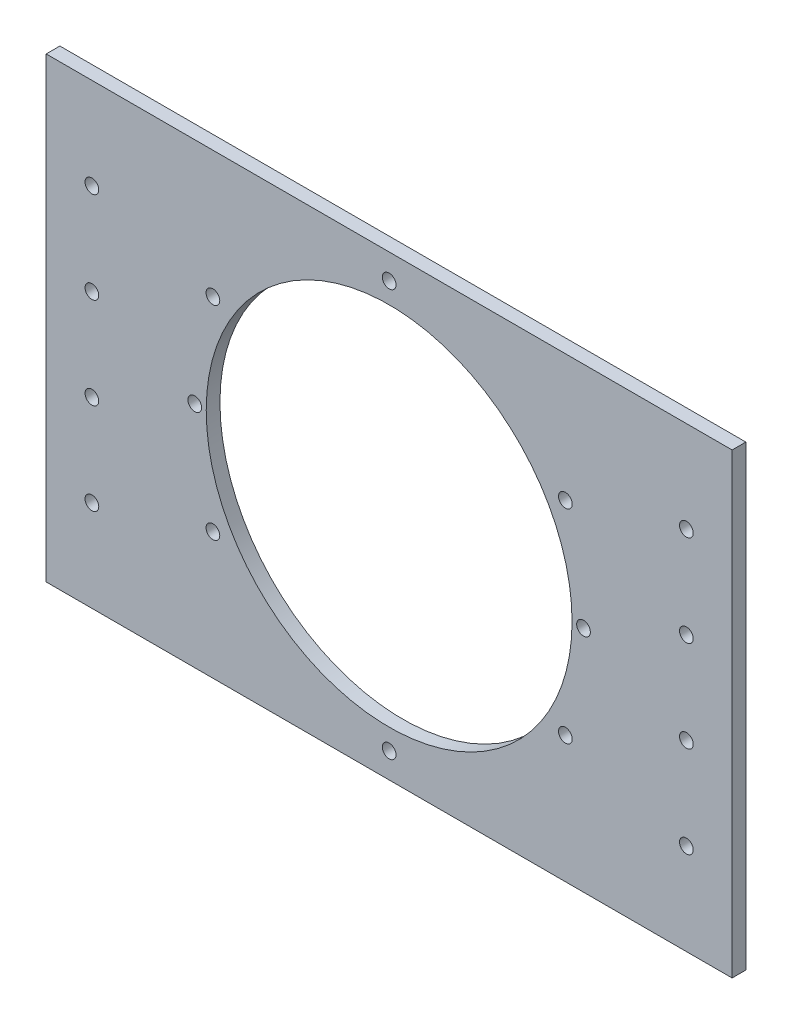
ISO-10303-21;
HEADER;
FILE_DESCRIPTION(('STEP AP214'),'2;1');
FILE_NAME('part.step','',(''),(''),'','','');
FILE_SCHEMA(('AUTOMOTIVE_DESIGN { 1 0 10303 214 1 1 1 1 }'));
ENDSEC;
DATA;
#1=APPLICATION_CONTEXT('core data for automotive mechanical design processes');
#2=APPLICATION_PROTOCOL_DEFINITION('international standard','automotive_design',2000,#1);
#3=PRODUCT_CONTEXT('',#1,'mechanical');
#4=PRODUCT('Part','Part','',(#3));
#5=PRODUCT_RELATED_PRODUCT_CATEGORY('part','',(#4));
#6=PRODUCT_DEFINITION_FORMATION('','',#4);
#7=PRODUCT_DEFINITION_CONTEXT('part definition',#1,'design');
#8=PRODUCT_DEFINITION('design','',#6,#7);
#9=PRODUCT_DEFINITION_SHAPE('','',#8);
#10=(LENGTH_UNIT() NAMED_UNIT(*) SI_UNIT(.MILLI.,.METRE.));
#11=(NAMED_UNIT(*) PLANE_ANGLE_UNIT() SI_UNIT($,.RADIAN.));
#12=(NAMED_UNIT(*) SI_UNIT($,.STERADIAN.) SOLID_ANGLE_UNIT());
#13=UNCERTAINTY_MEASURE_WITH_UNIT(LENGTH_MEASURE(1.E-05),#10,'distance_accuracy_value','');
#14=(GEOMETRIC_REPRESENTATION_CONTEXT(3) GLOBAL_UNCERTAINTY_ASSIGNED_CONTEXT((#13)) GLOBAL_UNIT_ASSIGNED_CONTEXT((#10,
#11,#12)) REPRESENTATION_CONTEXT('',''));
#15=CARTESIAN_POINT('',(0.,0.,0.));
#16=DIRECTION('',(0.,0.,1.));
#17=DIRECTION('',(1.,0.,0.));
#18=AXIS2_PLACEMENT_3D('',#15,#16,#17);
#19=CARTESIAN_POINT('',(75.,0.,3.));
#20=DIRECTION('',(1.,0.,0.));
#21=DIRECTION('',(0.,1.,0.));
#22=AXIS2_PLACEMENT_3D('',#19,#20,#21);
#23=PLANE('',#22);
#24=DIRECTION('',(0.,-1.,0.));
#25=VECTOR('',#24,1.);
#26=CARTESIAN_POINT('',(75.,0.,0.));
#27=LINE('',#26,#25);
#28=CARTESIAN_POINT('',(75.,50.,0.));
#29=VERTEX_POINT('',#28);
#30=CARTESIAN_POINT('',(75.,-50.,0.));
#31=VERTEX_POINT('',#30);
#32=EDGE_CURVE('E163',#29,#31,#27,.T.);
#33=ORIENTED_EDGE('',*,*,#32,.F.);
#34=DIRECTION('',(0.,0.,-1.));
#35=VECTOR('',#34,1.);
#36=CARTESIAN_POINT('',(75.,50.,3.));
#37=LINE('',#36,#35);
#38=CARTESIAN_POINT('',(75.,50.,3.));
#39=VERTEX_POINT('',#38);
#40=EDGE_CURVE('E11',#39,#29,#37,.T.);
#41=ORIENTED_EDGE('',*,*,#40,.F.);
#42=DIRECTION('',(0.,-1.,0.));
#43=VECTOR('',#42,1.);
#44=CARTESIAN_POINT('',(75.,0.,3.));
#45=LINE('',#44,#43);
#46=CARTESIAN_POINT('',(75.,-50.,3.));
#47=VERTEX_POINT('',#46);
#48=EDGE_CURVE('E105',#39,#47,#45,.T.);
#49=ORIENTED_EDGE('',*,*,#48,.T.);
#50=DIRECTION('',(0.,0.,-1.));
#51=VECTOR('',#50,1.);
#52=CARTESIAN_POINT('',(75.,-50.,3.));
#53=LINE('',#52,#51);
#54=EDGE_CURVE('E83',#47,#31,#53,.T.);
#55=ORIENTED_EDGE('',*,*,#54,.T.);
#56=EDGE_LOOP('',(#33,#41,#49,#55));
#57=FACE_BOUND('',#56,.T.);
#58=ADVANCED_FACE('F43',(#57),#23,.T.);
#59=CARTESIAN_POINT('',(0.,50.,3.));
#60=DIRECTION('',(0.,1.,0.));
#61=DIRECTION('',(0.,0.,1.));
#62=AXIS2_PLACEMENT_3D('',#59,#60,#61);
#63=PLANE('',#62);
#64=DIRECTION('',(1.,0.,0.));
#65=VECTOR('',#64,1.);
#66=CARTESIAN_POINT('',(0.,50.,0.));
#67=LINE('',#66,#65);
#68=CARTESIAN_POINT('',(-75.,50.,0.));
#69=VERTEX_POINT('',#68);
#70=EDGE_CURVE('E95',#69,#29,#67,.T.);
#71=ORIENTED_EDGE('',*,*,#70,.F.);
#72=DIRECTION('',(0.,0.,-1.));
#73=VECTOR('',#72,1.);
#74=CARTESIAN_POINT('',(-75.,50.,3.));
#75=LINE('',#74,#73);
#76=CARTESIAN_POINT('',(-75.,50.,3.));
#77=VERTEX_POINT('',#76);
#78=EDGE_CURVE('E52',#77,#69,#75,.T.);
#79=ORIENTED_EDGE('',*,*,#78,.F.);
#80=DIRECTION('',(1.,0.,0.));
#81=VECTOR('',#80,1.);
#82=CARTESIAN_POINT('',(0.,50.,3.));
#83=LINE('',#82,#81);
#84=EDGE_CURVE('E93',#77,#39,#83,.T.);
#85=ORIENTED_EDGE('',*,*,#84,.T.);
#86=ORIENTED_EDGE('',*,*,#40,.T.);
#87=EDGE_LOOP('',(#71,#79,#85,#86));
#88=FACE_BOUND('',#87,.T.);
#89=ADVANCED_FACE('F91',(#88),#63,.T.);
#90=CARTESIAN_POINT('',(-75.,0.,3.));
#91=DIRECTION('',(1.,0.,0.));
#92=DIRECTION('',(0.,1.,0.));
#93=AXIS2_PLACEMENT_3D('',#90,#91,#92);
#94=PLANE('',#93);
#95=DIRECTION('',(0.,-1.,0.));
#96=VECTOR('',#95,1.);
#97=CARTESIAN_POINT('',(-75.,0.,0.));
#98=LINE('',#97,#96);
#99=CARTESIAN_POINT('',(-75.,-50.,0.));
#100=VERTEX_POINT('',#99);
#101=EDGE_CURVE('E166',#69,#100,#98,.T.);
#102=ORIENTED_EDGE('',*,*,#101,.T.);
#103=DIRECTION('',(0.,0.,-1.));
#104=VECTOR('',#103,1.);
#105=CARTESIAN_POINT('',(-75.,-50.,3.));
#106=LINE('',#105,#104);
#107=CARTESIAN_POINT('',(-75.,-50.,3.));
#108=VERTEX_POINT('',#107);
#109=EDGE_CURVE('E98',#108,#100,#106,.T.);
#110=ORIENTED_EDGE('',*,*,#109,.F.);
#111=DIRECTION('',(0.,-1.,0.));
#112=VECTOR('',#111,1.);
#113=CARTESIAN_POINT('',(-75.,0.,3.));
#114=LINE('',#113,#112);
#115=EDGE_CURVE('E100',#77,#108,#114,.T.);
#116=ORIENTED_EDGE('',*,*,#115,.F.);
#117=ORIENTED_EDGE('',*,*,#78,.T.);
#118=EDGE_LOOP('',(#102,#110,#116,#117));
#119=FACE_BOUND('',#118,.T.);
#120=ADVANCED_FACE('F101',(#119),#94,.F.);
#121=CARTESIAN_POINT('',(65.,-9.99999999999998,3.));
#122=DIRECTION('',(0.,0.,-1.));
#123=DIRECTION('',(-1.,0.,0.));
#124=AXIS2_PLACEMENT_3D('',#121,#122,#123);
#125=CYLINDRICAL_SURFACE('',#124,1.5);
#126=CARTESIAN_POINT('',(65.,-9.99999999999998,3.));
#127=DIRECTION('',(0.,0.,1.));
#128=DIRECTION('',(1.,0.,0.));
#129=AXIS2_PLACEMENT_3D('',#126,#127,#128);
#130=CIRCLE('',#129,1.5);
#131=CARTESIAN_POINT('',(66.5,-9.99999999999998,3.));
#132=VERTEX_POINT('',#131);
#133=EDGE_CURVE('E112',#132,#132,#130,.F.);
#134=ORIENTED_EDGE('',*,*,#133,.F.);
#135=EDGE_LOOP('',(#134));
#136=FACE_BOUND('',#135,.T.);
#137=CARTESIAN_POINT('',(65.,-9.99999999999998,0.));
#138=DIRECTION('',(0.,0.,1.));
#139=DIRECTION('',(1.,0.,0.));
#140=AXIS2_PLACEMENT_3D('',#137,#138,#139);
#141=CIRCLE('',#140,1.5);
#142=CARTESIAN_POINT('',(66.5,-9.99999999999998,0.));
#143=VERTEX_POINT('',#142);
#144=EDGE_CURVE('E169',#143,#143,#141,.F.);
#145=ORIENTED_EDGE('',*,*,#144,.T.);
#146=EDGE_LOOP('',(#145));
#147=FACE_BOUND('',#146,.T.);
#148=ADVANCED_FACE('F305',(#136,#147),#125,.F.);
#149=CARTESIAN_POINT('',(0.,-50.,3.));
#150=DIRECTION('',(0.,1.,0.));
#151=DIRECTION('',(0.,0.,1.));
#152=AXIS2_PLACEMENT_3D('',#149,#150,#151);
#153=PLANE('',#152);
#154=DIRECTION('',(1.,0.,0.));
#155=VECTOR('',#154,1.);
#156=CARTESIAN_POINT('',(0.,-50.,0.));
#157=LINE('',#156,#155);
#158=EDGE_CURVE('E76',#100,#31,#157,.T.);
#159=ORIENTED_EDGE('',*,*,#158,.T.);
#160=ORIENTED_EDGE('',*,*,#54,.F.);
#161=DIRECTION('',(1.,0.,0.));
#162=VECTOR('',#161,1.);
#163=CARTESIAN_POINT('',(0.,-50.,3.));
#164=LINE('',#163,#162);
#165=EDGE_CURVE('E60',#108,#47,#164,.T.);
#166=ORIENTED_EDGE('',*,*,#165,.F.);
#167=ORIENTED_EDGE('',*,*,#109,.T.);
#168=EDGE_LOOP('',(#159,#160,#166,#167));
#169=FACE_BOUND('',#168,.T.);
#170=ADVANCED_FACE('F178',(#169),#153,.F.);
#171=CARTESIAN_POINT('',(-65.,30.,3.));
#172=DIRECTION('',(0.,0.,-1.));
#173=DIRECTION('',(-1.,0.,0.));
#174=AXIS2_PLACEMENT_3D('',#171,#172,#173);
#175=CYLINDRICAL_SURFACE('',#174,1.5);
#176=CARTESIAN_POINT('',(-65.,30.,3.));
#177=DIRECTION('',(0.,0.,1.));
#178=DIRECTION('',(1.,0.,0.));
#179=AXIS2_PLACEMENT_3D('',#176,#177,#178);
#180=CIRCLE('',#179,1.5);
#181=CARTESIAN_POINT('',(-63.5,30.,3.));
#182=VERTEX_POINT('',#181);
#183=EDGE_CURVE('E107',#182,#182,#180,.T.);
#184=ORIENTED_EDGE('',*,*,#183,.T.);
#185=EDGE_LOOP('',(#184));
#186=FACE_BOUND('',#185,.T.);
#187=CARTESIAN_POINT('',(-65.,30.,0.));
#188=DIRECTION('',(0.,0.,1.));
#189=DIRECTION('',(1.,0.,0.));
#190=AXIS2_PLACEMENT_3D('',#187,#188,#189);
#191=CIRCLE('',#190,1.5);
#192=CARTESIAN_POINT('',(-63.5,30.,0.));
#193=VERTEX_POINT('',#192);
#194=EDGE_CURVE('E160',#193,#193,#191,.T.);
#195=ORIENTED_EDGE('',*,*,#194,.F.);
#196=EDGE_LOOP('',(#195));
#197=FACE_BOUND('',#196,.T.);
#198=ADVANCED_FACE('F189',(#186,#197),#175,.F.);
#199=CARTESIAN_POINT('',(-65.,10.,3.));
#200=DIRECTION('',(0.,0.,-1.));
#201=DIRECTION('',(-1.,0.,0.));
#202=AXIS2_PLACEMENT_3D('',#199,#200,#201);
#203=CYLINDRICAL_SURFACE('',#202,1.5);
#204=CARTESIAN_POINT('',(-65.,10.,3.));
#205=DIRECTION('',(0.,0.,1.));
#206=DIRECTION('',(1.,0.,0.));
#207=AXIS2_PLACEMENT_3D('',#204,#205,#206);
#208=CIRCLE('',#207,1.5);
#209=CARTESIAN_POINT('',(-63.5,10.,3.));
#210=VERTEX_POINT('',#209);
#211=EDGE_CURVE('E513',#210,#210,#208,.T.);
#212=ORIENTED_EDGE('',*,*,#211,.T.);
#213=EDGE_LOOP('',(#212));
#214=FACE_BOUND('',#213,.T.);
#215=CARTESIAN_POINT('',(-65.,10.,0.));
#216=DIRECTION('',(0.,0.,1.));
#217=DIRECTION('',(1.,0.,0.));
#218=AXIS2_PLACEMENT_3D('',#215,#216,#217);
#219=CIRCLE('',#218,1.5);
#220=CARTESIAN_POINT('',(-63.5,10.,0.));
#221=VERTEX_POINT('',#220);
#222=EDGE_CURVE('E157',#221,#221,#219,.T.);
#223=ORIENTED_EDGE('',*,*,#222,.F.);
#224=EDGE_LOOP('',(#223));
#225=FACE_BOUND('',#224,.T.);
#226=ADVANCED_FACE('F192',(#214,#225),#203,.F.);
#227=CARTESIAN_POINT('',(-65.,-9.99999999999998,3.));
#228=DIRECTION('',(0.,0.,-1.));
#229=DIRECTION('',(-1.,0.,0.));
#230=AXIS2_PLACEMENT_3D('',#227,#228,#229);
#231=CYLINDRICAL_SURFACE('',#230,1.5);
#232=CARTESIAN_POINT('',(-65.,-9.99999999999998,3.));
#233=DIRECTION('',(0.,0.,1.));
#234=DIRECTION('',(1.,0.,0.));
#235=AXIS2_PLACEMENT_3D('',#232,#233,#234);
#236=CIRCLE('',#235,1.5);
#237=CARTESIAN_POINT('',(-63.5,-9.99999999999998,3.));
#238=VERTEX_POINT('',#237);
#239=EDGE_CURVE('E509',#238,#238,#236,.T.);
#240=ORIENTED_EDGE('',*,*,#239,.T.);
#241=EDGE_LOOP('',(#240));
#242=FACE_BOUND('',#241,.T.);
#243=CARTESIAN_POINT('',(-65.,-9.99999999999998,0.));
#244=DIRECTION('',(0.,0.,1.));
#245=DIRECTION('',(1.,0.,0.));
#246=AXIS2_PLACEMENT_3D('',#243,#244,#245);
#247=CIRCLE('',#246,1.5);
#248=CARTESIAN_POINT('',(-63.5,-9.99999999999998,0.));
#249=VERTEX_POINT('',#248);
#250=EDGE_CURVE('E154',#249,#249,#247,.T.);
#251=ORIENTED_EDGE('',*,*,#250,.F.);
#252=EDGE_LOOP('',(#251));
#253=FACE_BOUND('',#252,.T.);
#254=ADVANCED_FACE('F196',(#242,#253),#231,.F.);
#255=CARTESIAN_POINT('',(-65.,-30.,3.));
#256=DIRECTION('',(0.,0.,-1.));
#257=DIRECTION('',(-1.,0.,0.));
#258=AXIS2_PLACEMENT_3D('',#255,#256,#257);
#259=CYLINDRICAL_SURFACE('',#258,1.5);
#260=CARTESIAN_POINT('',(-65.,-30.,3.));
#261=DIRECTION('',(0.,0.,1.));
#262=DIRECTION('',(1.,0.,0.));
#263=AXIS2_PLACEMENT_3D('',#260,#261,#262);
#264=CIRCLE('',#263,1.5);
#265=CARTESIAN_POINT('',(-63.5,-30.,3.));
#266=VERTEX_POINT('',#265);
#267=EDGE_CURVE('E505',#266,#266,#264,.T.);
#268=ORIENTED_EDGE('',*,*,#267,.T.);
#269=EDGE_LOOP('',(#268));
#270=FACE_BOUND('',#269,.T.);
#271=CARTESIAN_POINT('',(-65.,-30.,0.));
#272=DIRECTION('',(0.,0.,1.));
#273=DIRECTION('',(1.,0.,0.));
#274=AXIS2_PLACEMENT_3D('',#271,#272,#273);
#275=CIRCLE('',#274,1.5);
#276=CARTESIAN_POINT('',(-63.5,-30.,0.));
#277=VERTEX_POINT('',#276);
#278=EDGE_CURVE('E151',#277,#277,#275,.T.);
#279=ORIENTED_EDGE('',*,*,#278,.F.);
#280=EDGE_LOOP('',(#279));
#281=FACE_BOUND('',#280,.T.);
#282=ADVANCED_FACE('F200',(#270,#281),#259,.F.);
#283=CARTESIAN_POINT('',(65.,-30.,3.));
#284=DIRECTION('',(0.,0.,-1.));
#285=DIRECTION('',(-1.,0.,0.));
#286=AXIS2_PLACEMENT_3D('',#283,#284,#285);
#287=CYLINDRICAL_SURFACE('',#286,1.5);
#288=CARTESIAN_POINT('',(65.,-30.,3.));
#289=DIRECTION('',(0.,0.,1.));
#290=DIRECTION('',(1.,0.,0.));
#291=AXIS2_PLACEMENT_3D('',#288,#289,#290);
#292=CIRCLE('',#291,1.5);
#293=CARTESIAN_POINT('',(66.5,-30.,3.));
#294=VERTEX_POINT('',#293);
#295=EDGE_CURVE('E501',#294,#294,#292,.F.);
#296=ORIENTED_EDGE('',*,*,#295,.F.);
#297=EDGE_LOOP('',(#296));
#298=FACE_BOUND('',#297,.T.);
#299=CARTESIAN_POINT('',(65.,-30.,0.));
#300=DIRECTION('',(0.,0.,1.));
#301=DIRECTION('',(1.,0.,0.));
#302=AXIS2_PLACEMENT_3D('',#299,#300,#301);
#303=CIRCLE('',#302,1.5);
#304=CARTESIAN_POINT('',(66.5,-30.,0.));
#305=VERTEX_POINT('',#304);
#306=EDGE_CURVE('E148',#305,#305,#303,.F.);
#307=ORIENTED_EDGE('',*,*,#306,.T.);
#308=EDGE_LOOP('',(#307));
#309=FACE_BOUND('',#308,.T.);
#310=ADVANCED_FACE('F204',(#298,#309),#287,.F.);
#311=CARTESIAN_POINT('',(65.,10.,3.));
#312=DIRECTION('',(0.,0.,-1.));
#313=DIRECTION('',(-1.,0.,0.));
#314=AXIS2_PLACEMENT_3D('',#311,#312,#313);
#315=CYLINDRICAL_SURFACE('',#314,1.5);
#316=CARTESIAN_POINT('',(65.,10.,3.));
#317=DIRECTION('',(0.,0.,1.));
#318=DIRECTION('',(1.,0.,0.));
#319=AXIS2_PLACEMENT_3D('',#316,#317,#318);
#320=CIRCLE('',#319,1.5);
#321=CARTESIAN_POINT('',(66.5,10.,3.));
#322=VERTEX_POINT('',#321);
#323=EDGE_CURVE('E497',#322,#322,#320,.F.);
#324=ORIENTED_EDGE('',*,*,#323,.F.);
#325=EDGE_LOOP('',(#324));
#326=FACE_BOUND('',#325,.T.);
#327=CARTESIAN_POINT('',(65.,10.,0.));
#328=DIRECTION('',(0.,0.,1.));
#329=DIRECTION('',(1.,0.,0.));
#330=AXIS2_PLACEMENT_3D('',#327,#328,#329);
#331=CIRCLE('',#330,1.5);
#332=CARTESIAN_POINT('',(66.5,10.,0.));
#333=VERTEX_POINT('',#332);
#334=EDGE_CURVE('E145',#333,#333,#331,.F.);
#335=ORIENTED_EDGE('',*,*,#334,.T.);
#336=EDGE_LOOP('',(#335));
#337=FACE_BOUND('',#336,.T.);
#338=ADVANCED_FACE('F208',(#326,#337),#315,.F.);
#339=CARTESIAN_POINT('',(0.,0.,3.));
#340=DIRECTION('',(0.,0.,-1.));
#341=DIRECTION('',(-1.,0.,0.));
#342=AXIS2_PLACEMENT_3D('',#339,#340,#341);
#343=CYLINDRICAL_SURFACE('',#342,40.);
#344=CARTESIAN_POINT('',(0.,0.,3.));
#345=DIRECTION('',(0.,0.,1.));
#346=DIRECTION('',(1.,0.,0.));
#347=AXIS2_PLACEMENT_3D('',#344,#345,#346);
#348=CIRCLE('',#347,40.);
#349=CARTESIAN_POINT('',(40.,0.,3.));
#350=VERTEX_POINT('',#349);
#351=EDGE_CURVE('E493',#350,#350,#348,.T.);
#352=ORIENTED_EDGE('',*,*,#351,.T.);
#353=EDGE_LOOP('',(#352));
#354=FACE_BOUND('',#353,.T.);
#355=CARTESIAN_POINT('',(0.,0.,0.));
#356=DIRECTION('',(0.,0.,1.));
#357=DIRECTION('',(1.,0.,0.));
#358=AXIS2_PLACEMENT_3D('',#355,#356,#357);
#359=CIRCLE('',#358,40.);
#360=CARTESIAN_POINT('',(40.,0.,0.));
#361=VERTEX_POINT('',#360);
#362=EDGE_CURVE('E142',#361,#361,#359,.T.);
#363=ORIENTED_EDGE('',*,*,#362,.F.);
#364=EDGE_LOOP('',(#363));
#365=FACE_BOUND('',#364,.T.);
#366=ADVANCED_FACE('F212',(#354,#365),#343,.F.);
#367=CARTESIAN_POINT('',(42.5,0.,3.));
#368=DIRECTION('',(0.,0.,-1.));
#369=DIRECTION('',(-1.,0.,0.));
#370=AXIS2_PLACEMENT_3D('',#367,#368,#369);
#371=CYLINDRICAL_SURFACE('',#370,1.5);
#372=CARTESIAN_POINT('',(42.5,0.,3.));
#373=DIRECTION('',(0.,0.,1.));
#374=DIRECTION('',(1.,0.,0.));
#375=AXIS2_PLACEMENT_3D('',#372,#373,#374);
#376=CIRCLE('',#375,1.5);
#377=CARTESIAN_POINT('',(44.,0.,3.));
#378=VERTEX_POINT('',#377);
#379=EDGE_CURVE('E489',#378,#378,#376,.T.);
#380=ORIENTED_EDGE('',*,*,#379,.T.);
#381=EDGE_LOOP('',(#380));
#382=FACE_BOUND('',#381,.T.);
#383=CARTESIAN_POINT('',(42.5,0.,0.));
#384=DIRECTION('',(0.,0.,1.));
#385=DIRECTION('',(1.,0.,0.));
#386=AXIS2_PLACEMENT_3D('',#383,#384,#385);
#387=CIRCLE('',#386,1.5);
#388=CARTESIAN_POINT('',(44.,0.,0.));
#389=VERTEX_POINT('',#388);
#390=EDGE_CURVE('E139',#389,#389,#387,.T.);
#391=ORIENTED_EDGE('',*,*,#390,.F.);
#392=EDGE_LOOP('',(#391));
#393=FACE_BOUND('',#392,.T.);
#394=ADVANCED_FACE('F216',(#382,#393),#371,.F.);
#395=CARTESIAN_POINT('',(-42.5,0.,3.));
#396=DIRECTION('',(0.,0.,-1.));
#397=DIRECTION('',(-1.,0.,0.));
#398=AXIS2_PLACEMENT_3D('',#395,#396,#397);
#399=CYLINDRICAL_SURFACE('',#398,1.5);
#400=CARTESIAN_POINT('',(-42.5,0.,3.));
#401=DIRECTION('',(0.,0.,1.));
#402=DIRECTION('',(1.,0.,0.));
#403=AXIS2_PLACEMENT_3D('',#400,#401,#402);
#404=CIRCLE('',#403,1.5);
#405=CARTESIAN_POINT('',(-41.,0.,3.));
#406=VERTEX_POINT('',#405);
#407=EDGE_CURVE('E485',#406,#406,#404,.T.);
#408=ORIENTED_EDGE('',*,*,#407,.T.);
#409=EDGE_LOOP('',(#408));
#410=FACE_BOUND('',#409,.T.);
#411=CARTESIAN_POINT('',(-42.5,0.,0.));
#412=DIRECTION('',(0.,0.,1.));
#413=DIRECTION('',(1.,0.,0.));
#414=AXIS2_PLACEMENT_3D('',#411,#412,#413);
#415=CIRCLE('',#414,1.5);
#416=CARTESIAN_POINT('',(-41.,0.,0.));
#417=VERTEX_POINT('',#416);
#418=EDGE_CURVE('E136',#417,#417,#415,.T.);
#419=ORIENTED_EDGE('',*,*,#418,.F.);
#420=EDGE_LOOP('',(#419));
#421=FACE_BOUND('',#420,.T.);
#422=ADVANCED_FACE('F220',(#410,#421),#399,.F.);
#423=CARTESIAN_POINT('',(0.,44.5,3.));
#424=DIRECTION('',(0.,0.,-1.));
#425=DIRECTION('',(-1.,0.,0.));
#426=AXIS2_PLACEMENT_3D('',#423,#424,#425);
#427=CYLINDRICAL_SURFACE('',#426,1.5);
#428=CARTESIAN_POINT('',(0.,44.5,3.));
#429=DIRECTION('',(0.,0.,1.));
#430=DIRECTION('',(1.,0.,0.));
#431=AXIS2_PLACEMENT_3D('',#428,#429,#430);
#432=CIRCLE('',#431,1.5);
#433=CARTESIAN_POINT('',(1.5,44.5,3.));
#434=VERTEX_POINT('',#433);
#435=EDGE_CURVE('E481',#434,#434,#432,.T.);
#436=ORIENTED_EDGE('',*,*,#435,.T.);
#437=EDGE_LOOP('',(#436));
#438=FACE_BOUND('',#437,.T.);
#439=CARTESIAN_POINT('',(0.,44.5,0.));
#440=DIRECTION('',(0.,0.,1.));
#441=DIRECTION('',(1.,0.,0.));
#442=AXIS2_PLACEMENT_3D('',#439,#440,#441);
#443=CIRCLE('',#442,1.5);
#444=CARTESIAN_POINT('',(1.5,44.5,0.));
#445=VERTEX_POINT('',#444);
#446=EDGE_CURVE('E133',#445,#445,#443,.T.);
#447=ORIENTED_EDGE('',*,*,#446,.F.);
#448=EDGE_LOOP('',(#447));
#449=FACE_BOUND('',#448,.T.);
#450=ADVANCED_FACE('F224',(#438,#449),#427,.F.);
#451=CARTESIAN_POINT('',(38.5381304684076,22.2499999999999,3.));
#452=DIRECTION('',(0.,0.,-1.));
#453=DIRECTION('',(-1.,0.,0.));
#454=AXIS2_PLACEMENT_3D('',#451,#452,#453);
#455=CYLINDRICAL_SURFACE('',#454,1.50000000000001);
#456=CARTESIAN_POINT('',(38.5381304684076,22.2499999999999,3.));
#457=DIRECTION('',(0.,0.,1.));
#458=DIRECTION('',(1.,0.,0.));
#459=AXIS2_PLACEMENT_3D('',#456,#457,#458);
#460=CIRCLE('',#459,1.50000000000001);
#461=CARTESIAN_POINT('',(40.0381304684076,22.2499999999999,3.));
#462=VERTEX_POINT('',#461);
#463=EDGE_CURVE('E477',#462,#462,#460,.T.);
#464=ORIENTED_EDGE('',*,*,#463,.T.);
#465=EDGE_LOOP('',(#464));
#466=FACE_BOUND('',#465,.T.);
#467=CARTESIAN_POINT('',(38.5381304684076,22.2499999999999,0.));
#468=DIRECTION('',(0.,0.,1.));
#469=DIRECTION('',(1.,0.,0.));
#470=AXIS2_PLACEMENT_3D('',#467,#468,#469);
#471=CIRCLE('',#470,1.50000000000001);
#472=CARTESIAN_POINT('',(40.0381304684076,22.2499999999999,0.));
#473=VERTEX_POINT('',#472);
#474=EDGE_CURVE('E130',#473,#473,#471,.T.);
#475=ORIENTED_EDGE('',*,*,#474,.F.);
#476=EDGE_LOOP('',(#475));
#477=FACE_BOUND('',#476,.T.);
#478=ADVANCED_FACE('F228',(#466,#477),#455,.F.);
#479=CARTESIAN_POINT('',(38.5381304684074,-22.2500000000002,3.));
#480=DIRECTION('',(0.,0.,-1.));
#481=DIRECTION('',(-1.,0.,0.));
#482=AXIS2_PLACEMENT_3D('',#479,#480,#481);
#483=CYLINDRICAL_SURFACE('',#482,1.5);
#484=CARTESIAN_POINT('',(38.5381304684074,-22.2500000000002,3.));
#485=DIRECTION('',(0.,0.,1.));
#486=DIRECTION('',(1.,0.,0.));
#487=AXIS2_PLACEMENT_3D('',#484,#485,#486);
#488=CIRCLE('',#487,1.5);
#489=CARTESIAN_POINT('',(40.0381304684074,-22.2500000000002,3.));
#490=VERTEX_POINT('',#489);
#491=EDGE_CURVE('E473',#490,#490,#488,.T.);
#492=ORIENTED_EDGE('',*,*,#491,.T.);
#493=EDGE_LOOP('',(#492));
#494=FACE_BOUND('',#493,.T.);
#495=CARTESIAN_POINT('',(38.5381304684074,-22.2500000000002,0.));
#496=DIRECTION('',(0.,0.,1.));
#497=DIRECTION('',(1.,0.,0.));
#498=AXIS2_PLACEMENT_3D('',#495,#496,#497);
#499=CIRCLE('',#498,1.5);
#500=CARTESIAN_POINT('',(40.0381304684074,-22.2500000000002,0.));
#501=VERTEX_POINT('',#500);
#502=EDGE_CURVE('E127',#501,#501,#499,.T.);
#503=ORIENTED_EDGE('',*,*,#502,.F.);
#504=EDGE_LOOP('',(#503));
#505=FACE_BOUND('',#504,.T.);
#506=ADVANCED_FACE('F232',(#494,#505),#483,.F.);
#507=CARTESIAN_POINT('',(-3.10741839157039E-13,-44.5,3.));
#508=DIRECTION('',(0.,0.,-1.));
#509=DIRECTION('',(-1.,0.,0.));
#510=AXIS2_PLACEMENT_3D('',#507,#508,#509);
#511=CYLINDRICAL_SURFACE('',#510,1.5);
#512=CARTESIAN_POINT('',(-3.10741839157039E-13,-44.5,3.));
#513=DIRECTION('',(0.,0.,1.));
#514=DIRECTION('',(1.,0.,0.));
#515=AXIS2_PLACEMENT_3D('',#512,#513,#514);
#516=CIRCLE('',#515,1.5);
#517=CARTESIAN_POINT('',(1.49999999999969,-44.5,3.));
#518=VERTEX_POINT('',#517);
#519=EDGE_CURVE('E469',#518,#518,#516,.T.);
#520=ORIENTED_EDGE('',*,*,#519,.T.);
#521=EDGE_LOOP('',(#520));
#522=FACE_BOUND('',#521,.T.);
#523=CARTESIAN_POINT('',(-3.10741839157039E-13,-44.5,0.));
#524=DIRECTION('',(0.,0.,1.));
#525=DIRECTION('',(1.,0.,0.));
#526=AXIS2_PLACEMENT_3D('',#523,#524,#525);
#527=CIRCLE('',#526,1.5);
#528=CARTESIAN_POINT('',(1.49999999999969,-44.5,0.));
#529=VERTEX_POINT('',#528);
#530=EDGE_CURVE('E124',#529,#529,#527,.T.);
#531=ORIENTED_EDGE('',*,*,#530,.F.);
#532=EDGE_LOOP('',(#531));
#533=FACE_BOUND('',#532,.T.);
#534=ADVANCED_FACE('F236',(#522,#533),#511,.F.);
#535=CARTESIAN_POINT('',(-38.5381304684077,-22.2499999999996,3.));
#536=DIRECTION('',(0.,0.,-1.));
#537=DIRECTION('',(-1.,0.,0.));
#538=AXIS2_PLACEMENT_3D('',#535,#536,#537);
#539=CYLINDRICAL_SURFACE('',#538,1.5);
#540=CARTESIAN_POINT('',(-38.5381304684077,-22.2499999999996,3.));
#541=DIRECTION('',(0.,0.,1.));
#542=DIRECTION('',(1.,0.,0.));
#543=AXIS2_PLACEMENT_3D('',#540,#541,#542);
#544=CIRCLE('',#543,1.5);
#545=CARTESIAN_POINT('',(-37.0381304684077,-22.2499999999996,3.));
#546=VERTEX_POINT('',#545);
#547=EDGE_CURVE('E251',#546,#546,#544,.T.);
#548=ORIENTED_EDGE('',*,*,#547,.T.);
#549=EDGE_LOOP('',(#548));
#550=FACE_BOUND('',#549,.T.);
#551=CARTESIAN_POINT('',(-38.5381304684077,-22.2499999999996,0.));
#552=DIRECTION('',(0.,0.,1.));
#553=DIRECTION('',(1.,0.,0.));
#554=AXIS2_PLACEMENT_3D('',#551,#552,#553);
#555=CIRCLE('',#554,1.5);
#556=CARTESIAN_POINT('',(-37.0381304684077,-22.2499999999996,0.));
#557=VERTEX_POINT('',#556);
#558=EDGE_CURVE('E121',#557,#557,#555,.T.);
#559=ORIENTED_EDGE('',*,*,#558,.F.);
#560=EDGE_LOOP('',(#559));
#561=FACE_BOUND('',#560,.T.);
#562=ADVANCED_FACE('F239',(#550,#561),#539,.F.);
#563=CARTESIAN_POINT('',(-38.5381304684073,22.2500000000004,3.));
#564=DIRECTION('',(0.,0.,-1.));
#565=DIRECTION('',(-1.,0.,0.));
#566=AXIS2_PLACEMENT_3D('',#563,#564,#565);
#567=CYLINDRICAL_SURFACE('',#566,1.5);
#568=CARTESIAN_POINT('',(-38.5381304684073,22.2500000000004,3.));
#569=DIRECTION('',(0.,0.,1.));
#570=DIRECTION('',(1.,0.,0.));
#571=AXIS2_PLACEMENT_3D('',#568,#569,#570);
#572=CIRCLE('',#571,1.5);
#573=CARTESIAN_POINT('',(-37.0381304684073,22.2500000000004,3.));
#574=VERTEX_POINT('',#573);
#575=EDGE_CURVE('E175',#574,#574,#572,.T.);
#576=ORIENTED_EDGE('',*,*,#575,.T.);
#577=EDGE_LOOP('',(#576));
#578=FACE_BOUND('',#577,.T.);
#579=CARTESIAN_POINT('',(-38.5381304684073,22.2500000000004,0.));
#580=DIRECTION('',(0.,0.,1.));
#581=DIRECTION('',(1.,0.,0.));
#582=AXIS2_PLACEMENT_3D('',#579,#580,#581);
#583=CIRCLE('',#582,1.5);
#584=CARTESIAN_POINT('',(-37.0381304684073,22.2500000000004,0.));
#585=VERTEX_POINT('',#584);
#586=EDGE_CURVE('E118',#585,#585,#583,.T.);
#587=ORIENTED_EDGE('',*,*,#586,.F.);
#588=EDGE_LOOP('',(#587));
#589=FACE_BOUND('',#588,.T.);
#590=ADVANCED_FACE('F45',(#578,#589),#567,.F.);
#591=CARTESIAN_POINT('',(65.,30.,3.));
#592=DIRECTION('',(0.,0.,-1.));
#593=DIRECTION('',(-1.,0.,0.));
#594=AXIS2_PLACEMENT_3D('',#591,#592,#593);
#595=CYLINDRICAL_SURFACE('',#594,1.5);
#596=CARTESIAN_POINT('',(65.,30.,3.));
#597=DIRECTION('',(0.,0.,1.));
#598=DIRECTION('',(1.,0.,0.));
#599=AXIS2_PLACEMENT_3D('',#596,#597,#598);
#600=CIRCLE('',#599,1.5);
#601=CARTESIAN_POINT('',(66.5,30.,3.));
#602=VERTEX_POINT('',#601);
#603=EDGE_CURVE('E115',#602,#602,#600,.F.);
#604=ORIENTED_EDGE('',*,*,#603,.F.);
#605=EDGE_LOOP('',(#604));
#606=FACE_BOUND('',#605,.T.);
#607=CARTESIAN_POINT('',(65.,30.,0.));
#608=DIRECTION('',(0.,0.,1.));
#609=DIRECTION('',(1.,0.,0.));
#610=AXIS2_PLACEMENT_3D('',#607,#608,#609);
#611=CIRCLE('',#610,1.5);
#612=CARTESIAN_POINT('',(66.5,30.,0.));
#613=VERTEX_POINT('',#612);
#614=EDGE_CURVE('E172',#613,#613,#611,.F.);
#615=ORIENTED_EDGE('',*,*,#614,.T.);
#616=EDGE_LOOP('',(#615));
#617=FACE_BOUND('',#616,.T.);
#618=ADVANCED_FACE('F246',(#606,#617),#595,.F.);
#619=CARTESIAN_POINT('',(0.,0.,3.));
#620=DIRECTION('',(0.,0.,1.));
#621=DIRECTION('',(1.,0.,0.));
#622=AXIS2_PLACEMENT_3D('',#619,#620,#621);
#623=PLANE('',#622);
#624=ORIENTED_EDGE('',*,*,#575,.F.);
#625=EDGE_LOOP('',(#624));
#626=FACE_BOUND('',#625,.T.);
#627=ORIENTED_EDGE('',*,*,#547,.F.);
#628=EDGE_LOOP('',(#627));
#629=FACE_BOUND('',#628,.T.);
#630=ORIENTED_EDGE('',*,*,#519,.F.);
#631=EDGE_LOOP('',(#630));
#632=FACE_BOUND('',#631,.T.);
#633=ORIENTED_EDGE('',*,*,#491,.F.);
#634=EDGE_LOOP('',(#633));
#635=FACE_BOUND('',#634,.T.);
#636=ORIENTED_EDGE('',*,*,#463,.F.);
#637=EDGE_LOOP('',(#636));
#638=FACE_BOUND('',#637,.T.);
#639=ORIENTED_EDGE('',*,*,#435,.F.);
#640=EDGE_LOOP('',(#639));
#641=FACE_BOUND('',#640,.T.);
#642=ORIENTED_EDGE('',*,*,#407,.F.);
#643=EDGE_LOOP('',(#642));
#644=FACE_BOUND('',#643,.T.);
#645=ORIENTED_EDGE('',*,*,#379,.F.);
#646=EDGE_LOOP('',(#645));
#647=FACE_BOUND('',#646,.T.);
#648=ORIENTED_EDGE('',*,*,#351,.F.);
#649=EDGE_LOOP('',(#648));
#650=FACE_BOUND('',#649,.T.);
#651=ORIENTED_EDGE('',*,*,#323,.T.);
#652=EDGE_LOOP('',(#651));
#653=FACE_BOUND('',#652,.T.);
#654=ORIENTED_EDGE('',*,*,#295,.T.);
#655=EDGE_LOOP('',(#654));
#656=FACE_BOUND('',#655,.T.);
#657=ORIENTED_EDGE('',*,*,#267,.F.);
#658=EDGE_LOOP('',(#657));
#659=FACE_BOUND('',#658,.T.);
#660=ORIENTED_EDGE('',*,*,#239,.F.);
#661=EDGE_LOOP('',(#660));
#662=FACE_BOUND('',#661,.T.);
#663=ORIENTED_EDGE('',*,*,#211,.F.);
#664=EDGE_LOOP('',(#663));
#665=FACE_BOUND('',#664,.T.);
#666=ORIENTED_EDGE('',*,*,#183,.F.);
#667=EDGE_LOOP('',(#666));
#668=FACE_BOUND('',#667,.T.);
#669=ORIENTED_EDGE('',*,*,#48,.F.);
#670=ORIENTED_EDGE('',*,*,#84,.F.);
#671=ORIENTED_EDGE('',*,*,#115,.T.);
#672=ORIENTED_EDGE('',*,*,#165,.T.);
#673=EDGE_LOOP('',(#669,#670,#671,#672));
#674=FACE_BOUND('',#673,.T.);
#675=ORIENTED_EDGE('',*,*,#133,.T.);
#676=EDGE_LOOP('',(#675));
#677=FACE_BOUND('',#676,.T.);
#678=ORIENTED_EDGE('',*,*,#603,.T.);
#679=EDGE_LOOP('',(#678));
#680=FACE_BOUND('',#679,.T.);
#681=ADVANCED_FACE('F103',(#626,#629,#632,#635,#638,#641,#644,#647,#650,#653,#656,#659,#662,
#665,#668,#674,#677,#680),#623,.T.);
#682=CARTESIAN_POINT('',(0.,0.,0.));
#683=DIRECTION('',(0.,0.,1.));
#684=DIRECTION('',(1.,0.,0.));
#685=AXIS2_PLACEMENT_3D('',#682,#683,#684);
#686=PLANE('',#685);
#687=ORIENTED_EDGE('',*,*,#586,.T.);
#688=EDGE_LOOP('',(#687));
#689=FACE_BOUND('',#688,.T.);
#690=ORIENTED_EDGE('',*,*,#558,.T.);
#691=EDGE_LOOP('',(#690));
#692=FACE_BOUND('',#691,.T.);
#693=ORIENTED_EDGE('',*,*,#530,.T.);
#694=EDGE_LOOP('',(#693));
#695=FACE_BOUND('',#694,.T.);
#696=ORIENTED_EDGE('',*,*,#502,.T.);
#697=EDGE_LOOP('',(#696));
#698=FACE_BOUND('',#697,.T.);
#699=ORIENTED_EDGE('',*,*,#474,.T.);
#700=EDGE_LOOP('',(#699));
#701=FACE_BOUND('',#700,.T.);
#702=ORIENTED_EDGE('',*,*,#446,.T.);
#703=EDGE_LOOP('',(#702));
#704=FACE_BOUND('',#703,.T.);
#705=ORIENTED_EDGE('',*,*,#418,.T.);
#706=EDGE_LOOP('',(#705));
#707=FACE_BOUND('',#706,.T.);
#708=ORIENTED_EDGE('',*,*,#390,.T.);
#709=EDGE_LOOP('',(#708));
#710=FACE_BOUND('',#709,.T.);
#711=ORIENTED_EDGE('',*,*,#362,.T.);
#712=EDGE_LOOP('',(#711));
#713=FACE_BOUND('',#712,.T.);
#714=ORIENTED_EDGE('',*,*,#334,.F.);
#715=EDGE_LOOP('',(#714));
#716=FACE_BOUND('',#715,.T.);
#717=ORIENTED_EDGE('',*,*,#306,.F.);
#718=EDGE_LOOP('',(#717));
#719=FACE_BOUND('',#718,.T.);
#720=ORIENTED_EDGE('',*,*,#278,.T.);
#721=EDGE_LOOP('',(#720));
#722=FACE_BOUND('',#721,.T.);
#723=ORIENTED_EDGE('',*,*,#250,.T.);
#724=EDGE_LOOP('',(#723));
#725=FACE_BOUND('',#724,.T.);
#726=ORIENTED_EDGE('',*,*,#222,.T.);
#727=EDGE_LOOP('',(#726));
#728=FACE_BOUND('',#727,.T.);
#729=ORIENTED_EDGE('',*,*,#194,.T.);
#730=EDGE_LOOP('',(#729));
#731=FACE_BOUND('',#730,.T.);
#732=ORIENTED_EDGE('',*,*,#32,.T.);
#733=ORIENTED_EDGE('',*,*,#158,.F.);
#734=ORIENTED_EDGE('',*,*,#101,.F.);
#735=ORIENTED_EDGE('',*,*,#70,.T.);
#736=EDGE_LOOP('',(#732,#733,#734,#735));
#737=FACE_BOUND('',#736,.T.);
#738=ORIENTED_EDGE('',*,*,#144,.F.);
#739=EDGE_LOOP('',(#738));
#740=FACE_BOUND('',#739,.T.);
#741=ORIENTED_EDGE('',*,*,#614,.F.);
#742=EDGE_LOOP('',(#741));
#743=FACE_BOUND('',#742,.T.);
#744=ADVANCED_FACE('F179',(#689,#692,#695,#698,#701,#704,#707,#710,#713,#716,#719,#722,#725,
#728,#731,#737,#740,#743),#686,.F.);
#745=CLOSED_SHELL('',(#58,#89,#120,#148,#170,#198,#226,#254,#282,#310,#338,#366,#394,#422,#450,
#478,#506,#534,#562,#590,#618,#681,#744));
#746=MANIFOLD_SOLID_BREP('B2',#745);
#747=ADVANCED_BREP_SHAPE_REPRESENTATION('',(#18,#746),#14);
#748=SHAPE_DEFINITION_REPRESENTATION(#9,#747);
ENDSEC;
END-ISO-10303-21;
